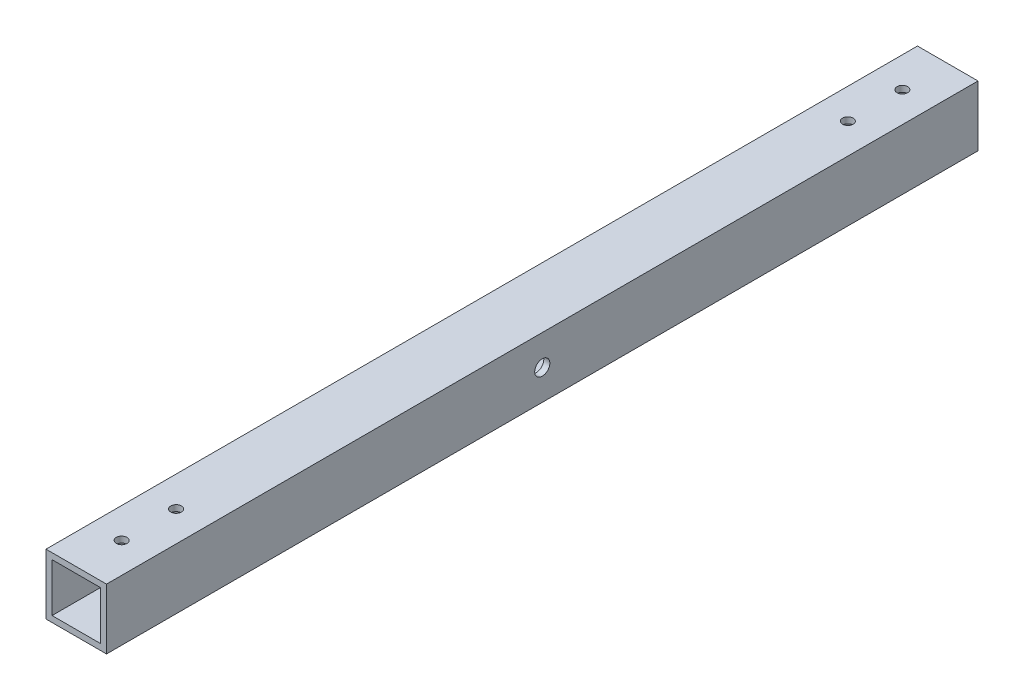
ISO-10303-21;
HEADER;
FILE_DESCRIPTION(('STEP AP214'),'2;1');
FILE_NAME('part.step','',(''),(''),'','','');
FILE_SCHEMA(('AUTOMOTIVE_DESIGN { 1 0 10303 214 1 1 1 1 }'));
ENDSEC;
DATA;
#1=APPLICATION_CONTEXT('core data for automotive mechanical design processes');
#2=APPLICATION_PROTOCOL_DEFINITION('international standard','automotive_design',2000,#1);
#3=PRODUCT_CONTEXT('',#1,'mechanical');
#4=PRODUCT('Part','Part','',(#3));
#5=PRODUCT_RELATED_PRODUCT_CATEGORY('part','',(#4));
#6=PRODUCT_DEFINITION_FORMATION('','',#4);
#7=PRODUCT_DEFINITION_CONTEXT('part definition',#1,'design');
#8=PRODUCT_DEFINITION('design','',#6,#7);
#9=PRODUCT_DEFINITION_SHAPE('','',#8);
#10=(LENGTH_UNIT() NAMED_UNIT(*) SI_UNIT(.MILLI.,.METRE.));
#11=(NAMED_UNIT(*) PLANE_ANGLE_UNIT() SI_UNIT($,.RADIAN.));
#12=(NAMED_UNIT(*) SI_UNIT($,.STERADIAN.) SOLID_ANGLE_UNIT());
#13=UNCERTAINTY_MEASURE_WITH_UNIT(LENGTH_MEASURE(1.E-05),#10,'distance_accuracy_value','');
#14=(GEOMETRIC_REPRESENTATION_CONTEXT(3) GLOBAL_UNCERTAINTY_ASSIGNED_CONTEXT((#13)) GLOBAL_UNIT_ASSIGNED_CONTEXT((#10,
#11,#12)) REPRESENTATION_CONTEXT('',''));
#15=CARTESIAN_POINT('',(0.,0.,0.));
#16=DIRECTION('',(0.,0.,1.));
#17=DIRECTION('',(1.,0.,0.));
#18=AXIS2_PLACEMENT_3D('',#15,#16,#17);
#19=CARTESIAN_POINT('',(0.,0.,457.2));
#20=DIRECTION('',(0.,0.,1.));
#21=DIRECTION('',(1.,0.,0.));
#22=AXIS2_PLACEMENT_3D('',#19,#20,#21);
#23=PLANE('',#22);
#24=DIRECTION('',(0.,-1.,0.));
#25=VECTOR('',#24,1.);
#26=CARTESIAN_POINT('',(-31.75,-31.75,457.2));
#27=LINE('',#26,#25);
#28=CARTESIAN_POINT('',(-31.75,31.75,457.2));
#29=VERTEX_POINT('',#28);
#30=CARTESIAN_POINT('',(-31.75,-31.75,457.2));
#31=VERTEX_POINT('',#30);
#32=EDGE_CURVE('E114',#29,#31,#27,.T.);
#33=ORIENTED_EDGE('',*,*,#32,.T.);
#34=DIRECTION('',(1.,0.,0.));
#35=VECTOR('',#34,1.);
#36=CARTESIAN_POINT('',(31.75,-31.75,457.2));
#37=LINE('',#36,#35);
#38=CARTESIAN_POINT('',(31.75,-31.75,457.2));
#39=VERTEX_POINT('',#38);
#40=EDGE_CURVE('E162',#31,#39,#37,.T.);
#41=ORIENTED_EDGE('',*,*,#40,.T.);
#42=DIRECTION('',(0.,1.,0.));
#43=VECTOR('',#42,1.);
#44=CARTESIAN_POINT('',(31.75,-31.75,457.2));
#45=LINE('',#44,#43);
#46=CARTESIAN_POINT('',(31.75,31.75,457.2));
#47=VERTEX_POINT('',#46);
#48=EDGE_CURVE('E164',#39,#47,#45,.T.);
#49=ORIENTED_EDGE('',*,*,#48,.T.);
#50=DIRECTION('',(-1.,0.,0.));
#51=VECTOR('',#50,1.);
#52=CARTESIAN_POINT('',(31.75,31.75,457.2));
#53=LINE('',#52,#51);
#54=EDGE_CURVE('E61',#47,#29,#53,.T.);
#55=ORIENTED_EDGE('',*,*,#54,.T.);
#56=EDGE_LOOP('',(#33,#41,#49,#55));
#57=FACE_BOUND('',#56,.T.);
#58=DIRECTION('',(1.,0.,0.));
#59=VECTOR('',#58,1.);
#60=CARTESIAN_POINT('',(25.4,-25.4,457.2));
#61=LINE('',#60,#59);
#62=CARTESIAN_POINT('',(-25.4,-25.4,457.2));
#63=VERTEX_POINT('',#62);
#64=CARTESIAN_POINT('',(25.4,-25.4,457.2));
#65=VERTEX_POINT('',#64);
#66=EDGE_CURVE('E151',#63,#65,#61,.T.);
#67=ORIENTED_EDGE('',*,*,#66,.F.);
#68=DIRECTION('',(0.,-1.,0.));
#69=VECTOR('',#68,1.);
#70=CARTESIAN_POINT('',(-25.4,-25.4,457.2));
#71=LINE('',#70,#69);
#72=CARTESIAN_POINT('',(-25.4,25.4,457.2));
#73=VERTEX_POINT('',#72);
#74=EDGE_CURVE('E111',#73,#63,#71,.T.);
#75=ORIENTED_EDGE('',*,*,#74,.F.);
#76=DIRECTION('',(-1.,0.,0.));
#77=VECTOR('',#76,1.);
#78=CARTESIAN_POINT('',(25.4,25.4,457.2));
#79=LINE('',#78,#77);
#80=CARTESIAN_POINT('',(25.4,25.4,457.2));
#81=VERTEX_POINT('',#80);
#82=EDGE_CURVE('E155',#81,#73,#79,.T.);
#83=ORIENTED_EDGE('',*,*,#82,.F.);
#84=DIRECTION('',(0.,1.,0.));
#85=VECTOR('',#84,1.);
#86=CARTESIAN_POINT('',(25.4,-25.4,457.2));
#87=LINE('',#86,#85);
#88=EDGE_CURVE('E153',#65,#81,#87,.T.);
#89=ORIENTED_EDGE('',*,*,#88,.F.);
#90=EDGE_LOOP('',(#67,#75,#83,#89));
#91=FACE_BOUND('',#90,.T.);
#92=ADVANCED_FACE('F36',(#57,#91),#23,.T.);
#93=CARTESIAN_POINT('',(-31.75,-31.75,457.2));
#94=DIRECTION('',(1.,0.,0.));
#95=DIRECTION('',(0.,0.,-1.));
#96=AXIS2_PLACEMENT_3D('',#93,#94,#95);
#97=PLANE('',#96);
#98=CARTESIAN_POINT('',(-31.75,0.,0.));
#99=DIRECTION('',(1.,0.,0.));
#100=DIRECTION('',(0.,0.,-1.));
#101=AXIS2_PLACEMENT_3D('',#98,#99,#100);
#102=CIRCLE('',#101,7.9375);
#103=CARTESIAN_POINT('',(-31.75,0.,-7.93750000000006));
#104=VERTEX_POINT('',#103);
#105=EDGE_CURVE('E224',#104,#104,#102,.T.);
#106=ORIENTED_EDGE('',*,*,#105,.T.);
#107=EDGE_LOOP('',(#106));
#108=FACE_BOUND('',#107,.T.);
#109=DIRECTION('',(0.,0.,-1.));
#110=VECTOR('',#109,1.);
#111=CARTESIAN_POINT('',(-31.75,31.75,457.2));
#112=LINE('',#111,#110);
#113=CARTESIAN_POINT('',(-31.75,31.75,-457.2));
#114=VERTEX_POINT('',#113);
#115=EDGE_CURVE('E167',#29,#114,#112,.T.);
#116=ORIENTED_EDGE('',*,*,#115,.T.);
#117=DIRECTION('',(0.,-1.,0.));
#118=VECTOR('',#117,1.);
#119=CARTESIAN_POINT('',(-31.75,-31.75,-457.2));
#120=LINE('',#119,#118);
#121=CARTESIAN_POINT('',(-31.75,-31.75,-457.2));
#122=VERTEX_POINT('',#121);
#123=EDGE_CURVE('E138',#114,#122,#120,.T.);
#124=ORIENTED_EDGE('',*,*,#123,.T.);
#125=DIRECTION('',(0.,0.,-1.));
#126=VECTOR('',#125,1.);
#127=CARTESIAN_POINT('',(-31.75,-31.75,457.2));
#128=LINE('',#127,#126);
#129=EDGE_CURVE('E11',#31,#122,#128,.T.);
#130=ORIENTED_EDGE('',*,*,#129,.F.);
#131=ORIENTED_EDGE('',*,*,#32,.F.);
#132=EDGE_LOOP('',(#116,#124,#130,#131));
#133=FACE_BOUND('',#132,.T.);
#134=ADVANCED_FACE('F38',(#108,#133),#97,.F.);
#135=CARTESIAN_POINT('',(31.75,-31.75,457.2));
#136=DIRECTION('',(0.,1.,0.));
#137=DIRECTION('',(0.,0.,1.));
#138=AXIS2_PLACEMENT_3D('',#135,#136,#137);
#139=PLANE('',#138);
#140=CARTESIAN_POINT('',(0.,-31.75,-409.575));
#141=DIRECTION('',(0.,1.,0.));
#142=DIRECTION('',(0.,0.,1.));
#143=AXIS2_PLACEMENT_3D('',#140,#141,#142);
#144=CIRCLE('',#143,5.588);
#145=CARTESIAN_POINT('',(0.,-31.75,-403.987));
#146=VERTEX_POINT('',#145);
#147=EDGE_CURVE('E176',#146,#146,#144,.T.);
#148=ORIENTED_EDGE('',*,*,#147,.T.);
#149=EDGE_LOOP('',(#148));
#150=FACE_BOUND('',#149,.T.);
#151=CARTESIAN_POINT('',(0.,-31.75,409.575));
#152=DIRECTION('',(0.,1.,0.));
#153=DIRECTION('',(0.,0.,1.));
#154=AXIS2_PLACEMENT_3D('',#151,#152,#153);
#155=CIRCLE('',#154,5.58800000000001);
#156=CARTESIAN_POINT('',(0.,-31.75,415.163));
#157=VERTEX_POINT('',#156);
#158=EDGE_CURVE('E211',#157,#157,#155,.T.);
#159=ORIENTED_EDGE('',*,*,#158,.T.);
#160=EDGE_LOOP('',(#159));
#161=FACE_BOUND('',#160,.T.);
#162=CARTESIAN_POINT('',(0.,-31.75,352.425));
#163=DIRECTION('',(0.,1.,0.));
#164=DIRECTION('',(0.,0.,1.));
#165=AXIS2_PLACEMENT_3D('',#162,#163,#164);
#166=CIRCLE('',#165,5.58800000000001);
#167=CARTESIAN_POINT('',(0.,-31.75,358.013));
#168=VERTEX_POINT('',#167);
#169=EDGE_CURVE('E205',#168,#168,#166,.T.);
#170=ORIENTED_EDGE('',*,*,#169,.T.);
#171=EDGE_LOOP('',(#170));
#172=FACE_BOUND('',#171,.T.);
#173=CARTESIAN_POINT('',(0.,-31.75,-352.425));
#174=DIRECTION('',(0.,1.,0.));
#175=DIRECTION('',(0.,0.,1.));
#176=AXIS2_PLACEMENT_3D('',#173,#174,#175);
#177=CIRCLE('',#176,5.588);
#178=CARTESIAN_POINT('',(0.,-31.75,-346.837));
#179=VERTEX_POINT('',#178);
#180=EDGE_CURVE('E198',#179,#179,#177,.T.);
#181=ORIENTED_EDGE('',*,*,#180,.T.);
#182=EDGE_LOOP('',(#181));
#183=FACE_BOUND('',#182,.T.);
#184=ORIENTED_EDGE('',*,*,#129,.T.);
#185=DIRECTION('',(1.,0.,0.));
#186=VECTOR('',#185,1.);
#187=CARTESIAN_POINT('',(31.75,-31.75,-457.2));
#188=LINE('',#187,#186);
#189=CARTESIAN_POINT('',(31.75,-31.75,-457.2));
#190=VERTEX_POINT('',#189);
#191=EDGE_CURVE('E141',#122,#190,#188,.T.);
#192=ORIENTED_EDGE('',*,*,#191,.T.);
#193=DIRECTION('',(0.,0.,-1.));
#194=VECTOR('',#193,1.);
#195=CARTESIAN_POINT('',(31.75,-31.75,457.2));
#196=LINE('',#195,#194);
#197=EDGE_CURVE('E45',#39,#190,#196,.T.);
#198=ORIENTED_EDGE('',*,*,#197,.F.);
#199=ORIENTED_EDGE('',*,*,#40,.F.);
#200=EDGE_LOOP('',(#184,#192,#198,#199));
#201=FACE_BOUND('',#200,.T.);
#202=ADVANCED_FACE('F248',(#150,#161,#172,#183,#201),#139,.F.);
#203=CARTESIAN_POINT('',(31.75,-31.75,457.2));
#204=DIRECTION('',(-1.,0.,0.));
#205=DIRECTION('',(0.,0.,1.));
#206=AXIS2_PLACEMENT_3D('',#203,#204,#205);
#207=PLANE('',#206);
#208=CARTESIAN_POINT('',(31.75,0.,0.));
#209=DIRECTION('',(1.,0.,0.));
#210=DIRECTION('',(0.,0.,-1.));
#211=AXIS2_PLACEMENT_3D('',#208,#209,#210);
#212=CIRCLE('',#211,7.9375);
#213=CARTESIAN_POINT('',(31.75,0.,-7.93750000000006));
#214=VERTEX_POINT('',#213);
#215=EDGE_CURVE('E221',#214,#214,#212,.T.);
#216=ORIENTED_EDGE('',*,*,#215,.F.);
#217=EDGE_LOOP('',(#216));
#218=FACE_BOUND('',#217,.T.);
#219=ORIENTED_EDGE('',*,*,#197,.T.);
#220=DIRECTION('',(0.,1.,0.));
#221=VECTOR('',#220,1.);
#222=CARTESIAN_POINT('',(31.75,-31.75,-457.2));
#223=LINE('',#222,#221);
#224=CARTESIAN_POINT('',(31.75,31.75,-457.2));
#225=VERTEX_POINT('',#224);
#226=EDGE_CURVE('E144',#190,#225,#223,.T.);
#227=ORIENTED_EDGE('',*,*,#226,.T.);
#228=DIRECTION('',(0.,0.,-1.));
#229=VECTOR('',#228,1.);
#230=CARTESIAN_POINT('',(31.75,31.75,457.2));
#231=LINE('',#230,#229);
#232=EDGE_CURVE('E169',#47,#225,#231,.T.);
#233=ORIENTED_EDGE('',*,*,#232,.F.);
#234=ORIENTED_EDGE('',*,*,#48,.F.);
#235=EDGE_LOOP('',(#219,#227,#233,#234));
#236=FACE_BOUND('',#235,.T.);
#237=ADVANCED_FACE('F255',(#218,#236),#207,.F.);
#238=CARTESIAN_POINT('',(31.75,31.75,457.2));
#239=DIRECTION('',(0.,-1.,0.));
#240=DIRECTION('',(0.,0.,-1.));
#241=AXIS2_PLACEMENT_3D('',#238,#239,#240);
#242=PLANE('',#241);
#243=CARTESIAN_POINT('',(0.,31.75,-409.575));
#244=DIRECTION('',(0.,1.,0.));
#245=DIRECTION('',(0.,0.,1.));
#246=AXIS2_PLACEMENT_3D('',#243,#244,#245);
#247=CIRCLE('',#246,5.588);
#248=CARTESIAN_POINT('',(0.,31.75,-403.987));
#249=VERTEX_POINT('',#248);
#250=EDGE_CURVE('E214',#249,#249,#247,.T.);
#251=ORIENTED_EDGE('',*,*,#250,.F.);
#252=EDGE_LOOP('',(#251));
#253=FACE_BOUND('',#252,.T.);
#254=CARTESIAN_POINT('',(0.,31.75,409.575));
#255=DIRECTION('',(0.,1.,0.));
#256=DIRECTION('',(0.,0.,1.));
#257=AXIS2_PLACEMENT_3D('',#254,#255,#256);
#258=CIRCLE('',#257,5.58800000000001);
#259=CARTESIAN_POINT('',(0.,31.75,415.163));
#260=VERTEX_POINT('',#259);
#261=EDGE_CURVE('E208',#260,#260,#258,.T.);
#262=ORIENTED_EDGE('',*,*,#261,.F.);
#263=EDGE_LOOP('',(#262));
#264=FACE_BOUND('',#263,.T.);
#265=CARTESIAN_POINT('',(0.,31.75,352.425));
#266=DIRECTION('',(0.,1.,0.));
#267=DIRECTION('',(0.,0.,1.));
#268=AXIS2_PLACEMENT_3D('',#265,#266,#267);
#269=CIRCLE('',#268,5.58800000000001);
#270=CARTESIAN_POINT('',(0.,31.75,358.013));
#271=VERTEX_POINT('',#270);
#272=EDGE_CURVE('E202',#271,#271,#269,.T.);
#273=ORIENTED_EDGE('',*,*,#272,.F.);
#274=EDGE_LOOP('',(#273));
#275=FACE_BOUND('',#274,.T.);
#276=CARTESIAN_POINT('',(0.,31.75,-352.425));
#277=DIRECTION('',(0.,1.,0.));
#278=DIRECTION('',(0.,0.,1.));
#279=AXIS2_PLACEMENT_3D('',#276,#277,#278);
#280=CIRCLE('',#279,5.588);
#281=CARTESIAN_POINT('',(0.,31.75,-346.837));
#282=VERTEX_POINT('',#281);
#283=EDGE_CURVE('E195',#282,#282,#280,.T.);
#284=ORIENTED_EDGE('',*,*,#283,.F.);
#285=EDGE_LOOP('',(#284));
#286=FACE_BOUND('',#285,.T.);
#287=ORIENTED_EDGE('',*,*,#232,.T.);
#288=DIRECTION('',(-1.,0.,0.));
#289=VECTOR('',#288,1.);
#290=CARTESIAN_POINT('',(31.75,31.75,-457.2));
#291=LINE('',#290,#289);
#292=EDGE_CURVE('E147',#225,#114,#291,.T.);
#293=ORIENTED_EDGE('',*,*,#292,.T.);
#294=ORIENTED_EDGE('',*,*,#115,.F.);
#295=ORIENTED_EDGE('',*,*,#54,.F.);
#296=EDGE_LOOP('',(#287,#293,#294,#295));
#297=FACE_BOUND('',#296,.T.);
#298=ADVANCED_FACE('F252',(#253,#264,#275,#286,#297),#242,.F.);
#299=CARTESIAN_POINT('',(-25.4,-25.4,457.2));
#300=DIRECTION('',(1.,0.,0.));
#301=DIRECTION('',(0.,0.,-1.));
#302=AXIS2_PLACEMENT_3D('',#299,#300,#301);
#303=PLANE('',#302);
#304=CARTESIAN_POINT('',(-25.4,0.,0.));
#305=DIRECTION('',(1.,0.,0.));
#306=DIRECTION('',(0.,0.,-1.));
#307=AXIS2_PLACEMENT_3D('',#304,#305,#306);
#308=CIRCLE('',#307,7.9375);
#309=CARTESIAN_POINT('',(-25.4,0.,-7.93750000000006));
#310=VERTEX_POINT('',#309);
#311=EDGE_CURVE('E199',#310,#310,#308,.T.);
#312=ORIENTED_EDGE('',*,*,#311,.F.);
#313=EDGE_LOOP('',(#312));
#314=FACE_BOUND('',#313,.T.);
#315=DIRECTION('',(0.,0.,-1.));
#316=VECTOR('',#315,1.);
#317=CARTESIAN_POINT('',(-25.4,-25.4,457.2));
#318=LINE('',#317,#316);
#319=CARTESIAN_POINT('',(-25.4,-25.4,-457.2));
#320=VERTEX_POINT('',#319);
#321=EDGE_CURVE('E103',#63,#320,#318,.T.);
#322=ORIENTED_EDGE('',*,*,#321,.T.);
#323=DIRECTION('',(0.,-1.,0.));
#324=VECTOR('',#323,1.);
#325=CARTESIAN_POINT('',(-25.4,-25.4,-457.2));
#326=LINE('',#325,#324);
#327=CARTESIAN_POINT('',(-25.4,25.4,-457.2));
#328=VERTEX_POINT('',#327);
#329=EDGE_CURVE('E108',#328,#320,#326,.T.);
#330=ORIENTED_EDGE('',*,*,#329,.F.);
#331=DIRECTION('',(0.,0.,-1.));
#332=VECTOR('',#331,1.);
#333=CARTESIAN_POINT('',(-25.4,25.4,457.2));
#334=LINE('',#333,#332);
#335=EDGE_CURVE('E157',#73,#328,#334,.T.);
#336=ORIENTED_EDGE('',*,*,#335,.F.);
#337=ORIENTED_EDGE('',*,*,#74,.T.);
#338=EDGE_LOOP('',(#322,#330,#336,#337));
#339=FACE_BOUND('',#338,.T.);
#340=ADVANCED_FACE('F105',(#314,#339),#303,.T.);
#341=CARTESIAN_POINT('',(25.4,-25.4,457.2));
#342=DIRECTION('',(0.,1.,0.));
#343=DIRECTION('',(0.,0.,1.));
#344=AXIS2_PLACEMENT_3D('',#341,#342,#343);
#345=PLANE('',#344);
#346=CARTESIAN_POINT('',(0.,-25.4,-409.575));
#347=DIRECTION('',(0.,1.,0.));
#348=DIRECTION('',(0.,0.,1.));
#349=AXIS2_PLACEMENT_3D('',#346,#347,#348);
#350=CIRCLE('',#349,5.588);
#351=CARTESIAN_POINT('',(0.,-25.4,-403.987));
#352=VERTEX_POINT('',#351);
#353=EDGE_CURVE('E129',#352,#352,#350,.T.);
#354=ORIENTED_EDGE('',*,*,#353,.F.);
#355=EDGE_LOOP('',(#354));
#356=FACE_BOUND('',#355,.T.);
#357=CARTESIAN_POINT('',(0.,-25.4,409.575));
#358=DIRECTION('',(0.,1.,0.));
#359=DIRECTION('',(0.,0.,1.));
#360=AXIS2_PLACEMENT_3D('',#357,#358,#359);
#361=CIRCLE('',#360,5.58800000000001);
#362=CARTESIAN_POINT('',(0.,-25.4,415.163));
#363=VERTEX_POINT('',#362);
#364=EDGE_CURVE('E183',#363,#363,#361,.T.);
#365=ORIENTED_EDGE('',*,*,#364,.F.);
#366=EDGE_LOOP('',(#365));
#367=FACE_BOUND('',#366,.T.);
#368=CARTESIAN_POINT('',(0.,-25.4,352.425));
#369=DIRECTION('',(0.,1.,0.));
#370=DIRECTION('',(0.,0.,1.));
#371=AXIS2_PLACEMENT_3D('',#368,#369,#370);
#372=CIRCLE('',#371,5.58800000000001);
#373=CARTESIAN_POINT('',(0.,-25.4,358.013));
#374=VERTEX_POINT('',#373);
#375=EDGE_CURVE('E180',#374,#374,#372,.T.);
#376=ORIENTED_EDGE('',*,*,#375,.F.);
#377=EDGE_LOOP('',(#376));
#378=FACE_BOUND('',#377,.T.);
#379=CARTESIAN_POINT('',(0.,-25.4,-352.425));
#380=DIRECTION('',(0.,1.,0.));
#381=DIRECTION('',(0.,0.,1.));
#382=AXIS2_PLACEMENT_3D('',#379,#380,#381);
#383=CIRCLE('',#382,5.588);
#384=CARTESIAN_POINT('',(0.,-25.4,-346.837));
#385=VERTEX_POINT('',#384);
#386=EDGE_CURVE('E175',#385,#385,#383,.T.);
#387=ORIENTED_EDGE('',*,*,#386,.F.);
#388=EDGE_LOOP('',(#387));
#389=FACE_BOUND('',#388,.T.);
#390=DIRECTION('',(0.,0.,-1.));
#391=VECTOR('',#390,1.);
#392=CARTESIAN_POINT('',(25.4,-25.4,457.2));
#393=LINE('',#392,#391);
#394=CARTESIAN_POINT('',(25.4,-25.4,-457.2));
#395=VERTEX_POINT('',#394);
#396=EDGE_CURVE('E115',#65,#395,#393,.T.);
#397=ORIENTED_EDGE('',*,*,#396,.T.);
#398=DIRECTION('',(1.,0.,0.));
#399=VECTOR('',#398,1.);
#400=CARTESIAN_POINT('',(25.4,-25.4,-457.2));
#401=LINE('',#400,#399);
#402=EDGE_CURVE('E118',#320,#395,#401,.T.);
#403=ORIENTED_EDGE('',*,*,#402,.F.);
#404=ORIENTED_EDGE('',*,*,#321,.F.);
#405=ORIENTED_EDGE('',*,*,#66,.T.);
#406=EDGE_LOOP('',(#397,#403,#404,#405));
#407=FACE_BOUND('',#406,.T.);
#408=ADVANCED_FACE('F119',(#356,#367,#378,#389,#407),#345,.T.);
#409=CARTESIAN_POINT('',(25.4,-25.4,457.2));
#410=DIRECTION('',(-1.,0.,0.));
#411=DIRECTION('',(0.,0.,1.));
#412=AXIS2_PLACEMENT_3D('',#409,#410,#411);
#413=PLANE('',#412);
#414=CARTESIAN_POINT('',(25.4,0.,0.));
#415=DIRECTION('',(-1.,0.,0.));
#416=DIRECTION('',(0.,0.,1.));
#417=AXIS2_PLACEMENT_3D('',#414,#415,#416);
#418=CIRCLE('',#417,7.9375);
#419=CARTESIAN_POINT('',(25.4,0.,7.93749999999994));
#420=VERTEX_POINT('',#419);
#421=EDGE_CURVE('E40',#420,#420,#418,.T.);
#422=ORIENTED_EDGE('',*,*,#421,.F.);
#423=EDGE_LOOP('',(#422));
#424=FACE_BOUND('',#423,.T.);
#425=DIRECTION('',(0.,0.,-1.));
#426=VECTOR('',#425,1.);
#427=CARTESIAN_POINT('',(25.4,25.4,457.2));
#428=LINE('',#427,#426);
#429=CARTESIAN_POINT('',(25.4,25.4,-457.2));
#430=VERTEX_POINT('',#429);
#431=EDGE_CURVE('E53',#81,#430,#428,.T.);
#432=ORIENTED_EDGE('',*,*,#431,.T.);
#433=DIRECTION('',(0.,1.,0.));
#434=VECTOR('',#433,1.);
#435=CARTESIAN_POINT('',(25.4,-25.4,-457.2));
#436=LINE('',#435,#434);
#437=EDGE_CURVE('E124',#395,#430,#436,.T.);
#438=ORIENTED_EDGE('',*,*,#437,.F.);
#439=ORIENTED_EDGE('',*,*,#396,.F.);
#440=ORIENTED_EDGE('',*,*,#88,.T.);
#441=EDGE_LOOP('',(#432,#438,#439,#440));
#442=FACE_BOUND('',#441,.T.);
#443=ADVANCED_FACE('F234',(#424,#442),#413,.T.);
#444=CARTESIAN_POINT('',(25.4,25.4,457.2));
#445=DIRECTION('',(0.,-1.,0.));
#446=DIRECTION('',(0.,0.,-1.));
#447=AXIS2_PLACEMENT_3D('',#444,#445,#446);
#448=PLANE('',#447);
#449=CARTESIAN_POINT('',(0.,25.4,-409.575));
#450=DIRECTION('',(0.,-1.,0.));
#451=DIRECTION('',(0.,0.,-1.));
#452=AXIS2_PLACEMENT_3D('',#449,#450,#451);
#453=CIRCLE('',#452,5.588);
#454=CARTESIAN_POINT('',(0.,25.4,-415.163));
#455=VERTEX_POINT('',#454);
#456=EDGE_CURVE('E132',#455,#455,#453,.T.);
#457=ORIENTED_EDGE('',*,*,#456,.F.);
#458=EDGE_LOOP('',(#457));
#459=FACE_BOUND('',#458,.T.);
#460=CARTESIAN_POINT('',(0.,25.4,409.575));
#461=DIRECTION('',(0.,-1.,0.));
#462=DIRECTION('',(0.,0.,-1.));
#463=AXIS2_PLACEMENT_3D('',#460,#461,#462);
#464=CIRCLE('',#463,5.58800000000001);
#465=CARTESIAN_POINT('',(0.,25.4,403.987));
#466=VERTEX_POINT('',#465);
#467=EDGE_CURVE('E181',#466,#466,#464,.T.);
#468=ORIENTED_EDGE('',*,*,#467,.F.);
#469=EDGE_LOOP('',(#468));
#470=FACE_BOUND('',#469,.T.);
#471=CARTESIAN_POINT('',(0.,25.4,352.425));
#472=DIRECTION('',(0.,-1.,0.));
#473=DIRECTION('',(0.,0.,-1.));
#474=AXIS2_PLACEMENT_3D('',#471,#472,#473);
#475=CIRCLE('',#474,5.58800000000001);
#476=CARTESIAN_POINT('',(0.,25.4,346.837));
#477=VERTEX_POINT('',#476);
#478=EDGE_CURVE('E177',#477,#477,#475,.T.);
#479=ORIENTED_EDGE('',*,*,#478,.F.);
#480=EDGE_LOOP('',(#479));
#481=FACE_BOUND('',#480,.T.);
#482=CARTESIAN_POINT('',(0.,25.4,-352.425));
#483=DIRECTION('',(0.,-1.,0.));
#484=DIRECTION('',(0.,0.,-1.));
#485=AXIS2_PLACEMENT_3D('',#482,#483,#484);
#486=CIRCLE('',#485,5.588);
#487=CARTESIAN_POINT('',(0.,25.4,-358.013));
#488=VERTEX_POINT('',#487);
#489=EDGE_CURVE('E172',#488,#488,#486,.T.);
#490=ORIENTED_EDGE('',*,*,#489,.F.);
#491=EDGE_LOOP('',(#490));
#492=FACE_BOUND('',#491,.T.);
#493=ORIENTED_EDGE('',*,*,#335,.T.);
#494=DIRECTION('',(-1.,0.,0.));
#495=VECTOR('',#494,1.);
#496=CARTESIAN_POINT('',(25.4,25.4,-457.2));
#497=LINE('',#496,#495);
#498=EDGE_CURVE('E128',#430,#328,#497,.T.);
#499=ORIENTED_EDGE('',*,*,#498,.F.);
#500=ORIENTED_EDGE('',*,*,#431,.F.);
#501=ORIENTED_EDGE('',*,*,#82,.T.);
#502=EDGE_LOOP('',(#493,#499,#500,#501));
#503=FACE_BOUND('',#502,.T.);
#504=ADVANCED_FACE('F237',(#459,#470,#481,#492,#503),#448,.T.);
#505=CARTESIAN_POINT('',(0.,0.,-457.2));
#506=DIRECTION('',(0.,0.,1.));
#507=DIRECTION('',(1.,0.,0.));
#508=AXIS2_PLACEMENT_3D('',#505,#506,#507);
#509=PLANE('',#508);
#510=ORIENTED_EDGE('',*,*,#498,.T.);
#511=ORIENTED_EDGE('',*,*,#329,.T.);
#512=ORIENTED_EDGE('',*,*,#402,.T.);
#513=ORIENTED_EDGE('',*,*,#437,.T.);
#514=EDGE_LOOP('',(#510,#511,#512,#513));
#515=FACE_BOUND('',#514,.T.);
#516=ORIENTED_EDGE('',*,*,#123,.F.);
#517=ORIENTED_EDGE('',*,*,#292,.F.);
#518=ORIENTED_EDGE('',*,*,#226,.F.);
#519=ORIENTED_EDGE('',*,*,#191,.F.);
#520=EDGE_LOOP('',(#516,#517,#518,#519));
#521=FACE_BOUND('',#520,.T.);
#522=ADVANCED_FACE('F126',(#515,#521),#509,.F.);
#523=CARTESIAN_POINT('',(0.,-31.75,-352.425));
#524=DIRECTION('',(0.,1.,0.));
#525=DIRECTION('',(0.,0.,1.));
#526=AXIS2_PLACEMENT_3D('',#523,#524,#525);
#527=CYLINDRICAL_SURFACE('',#526,5.588);
#528=ORIENTED_EDGE('',*,*,#489,.T.);
#529=EDGE_LOOP('',(#528));
#530=FACE_BOUND('',#529,.T.);
#531=ORIENTED_EDGE('',*,*,#283,.T.);
#532=EDGE_LOOP('',(#531));
#533=FACE_BOUND('',#532,.T.);
#534=ADVANCED_FACE('F285',(#530,#533),#527,.F.);
#535=CARTESIAN_POINT('',(0.,-31.75,352.425));
#536=DIRECTION('',(0.,1.,0.));
#537=DIRECTION('',(0.,0.,1.));
#538=AXIS2_PLACEMENT_3D('',#535,#536,#537);
#539=CYLINDRICAL_SURFACE('',#538,5.58800000000001);
#540=ORIENTED_EDGE('',*,*,#478,.T.);
#541=EDGE_LOOP('',(#540));
#542=FACE_BOUND('',#541,.T.);
#543=ORIENTED_EDGE('',*,*,#272,.T.);
#544=EDGE_LOOP('',(#543));
#545=FACE_BOUND('',#544,.T.);
#546=ADVANCED_FACE('F290',(#542,#545),#539,.F.);
#547=CARTESIAN_POINT('',(0.,-31.75,409.575));
#548=DIRECTION('',(0.,1.,0.));
#549=DIRECTION('',(0.,0.,1.));
#550=AXIS2_PLACEMENT_3D('',#547,#548,#549);
#551=CYLINDRICAL_SURFACE('',#550,5.58800000000001);
#552=ORIENTED_EDGE('',*,*,#467,.T.);
#553=EDGE_LOOP('',(#552));
#554=FACE_BOUND('',#553,.T.);
#555=ORIENTED_EDGE('',*,*,#261,.T.);
#556=EDGE_LOOP('',(#555));
#557=FACE_BOUND('',#556,.T.);
#558=ADVANCED_FACE('F321',(#554,#557),#551,.F.);
#559=CARTESIAN_POINT('',(0.,-31.75,-409.575));
#560=DIRECTION('',(0.,1.,0.));
#561=DIRECTION('',(0.,0.,1.));
#562=AXIS2_PLACEMENT_3D('',#559,#560,#561);
#563=CYLINDRICAL_SURFACE('',#562,5.588);
#564=ORIENTED_EDGE('',*,*,#456,.T.);
#565=EDGE_LOOP('',(#564));
#566=FACE_BOUND('',#565,.T.);
#567=ORIENTED_EDGE('',*,*,#250,.T.);
#568=EDGE_LOOP('',(#567));
#569=FACE_BOUND('',#568,.T.);
#570=ADVANCED_FACE('F314',(#566,#569),#563,.F.);
#571=ORIENTED_EDGE('',*,*,#386,.T.);
#572=EDGE_LOOP('',(#571));
#573=FACE_BOUND('',#572,.T.);
#574=ORIENTED_EDGE('',*,*,#180,.F.);
#575=EDGE_LOOP('',(#574));
#576=FACE_BOUND('',#575,.T.);
#577=ADVANCED_FACE('F293',(#573,#576),#527,.F.);
#578=ORIENTED_EDGE('',*,*,#375,.T.);
#579=EDGE_LOOP('',(#578));
#580=FACE_BOUND('',#579,.T.);
#581=ORIENTED_EDGE('',*,*,#169,.F.);
#582=EDGE_LOOP('',(#581));
#583=FACE_BOUND('',#582,.T.);
#584=ADVANCED_FACE('F313',(#580,#583),#539,.F.);
#585=ORIENTED_EDGE('',*,*,#364,.T.);
#586=EDGE_LOOP('',(#585));
#587=FACE_BOUND('',#586,.T.);
#588=ORIENTED_EDGE('',*,*,#158,.F.);
#589=EDGE_LOOP('',(#588));
#590=FACE_BOUND('',#589,.T.);
#591=ADVANCED_FACE('F319',(#587,#590),#551,.F.);
#592=ORIENTED_EDGE('',*,*,#353,.T.);
#593=EDGE_LOOP('',(#592));
#594=FACE_BOUND('',#593,.T.);
#595=ORIENTED_EDGE('',*,*,#147,.F.);
#596=EDGE_LOOP('',(#595));
#597=FACE_BOUND('',#596,.T.);
#598=ADVANCED_FACE('F323',(#594,#597),#563,.F.);
#599=CARTESIAN_POINT('',(-31.75,0.,0.));
#600=DIRECTION('',(1.,0.,0.));
#601=DIRECTION('',(0.,0.,-1.));
#602=AXIS2_PLACEMENT_3D('',#599,#600,#601);
#603=CYLINDRICAL_SURFACE('',#602,7.9375);
#604=ORIENTED_EDGE('',*,*,#421,.T.);
#605=EDGE_LOOP('',(#604));
#606=FACE_BOUND('',#605,.T.);
#607=ORIENTED_EDGE('',*,*,#215,.T.);
#608=EDGE_LOOP('',(#607));
#609=FACE_BOUND('',#608,.T.);
#610=ADVANCED_FACE('F231',(#606,#609),#603,.F.);
#611=ORIENTED_EDGE('',*,*,#311,.T.);
#612=EDGE_LOOP('',(#611));
#613=FACE_BOUND('',#612,.T.);
#614=ORIENTED_EDGE('',*,*,#105,.F.);
#615=EDGE_LOOP('',(#614));
#616=FACE_BOUND('',#615,.T.);
#617=ADVANCED_FACE('F337',(#613,#616),#603,.F.);
#618=CLOSED_SHELL('',(#92,#134,#202,#237,#298,#340,#408,#443,#504,#522,#534,#546,#558,#570,#577,
#584,#591,#598,#610,#617));
#619=MANIFOLD_SOLID_BREP('B2',#618);
#620=ADVANCED_BREP_SHAPE_REPRESENTATION('',(#18,#619),#14);
#621=SHAPE_DEFINITION_REPRESENTATION(#9,#620);
ENDSEC;
END-ISO-10303-21;
